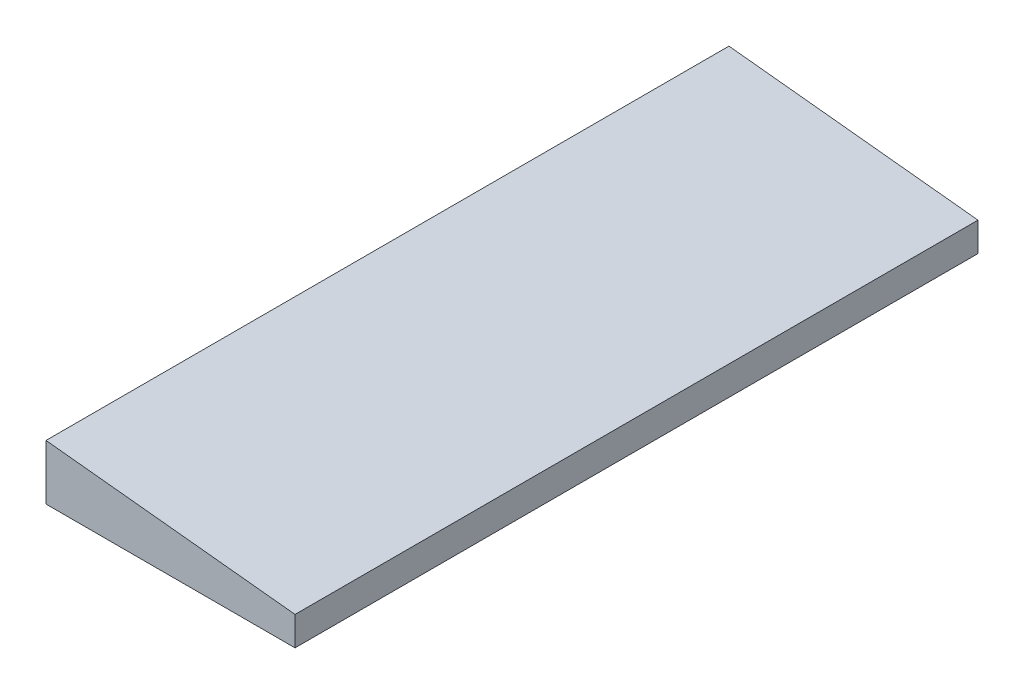
ISO-10303-21;
HEADER;
FILE_DESCRIPTION(('STEP AP214'),'2;1');
FILE_NAME('part.step','',(''),(''),'','','');
FILE_SCHEMA(('AUTOMOTIVE_DESIGN { 1 0 10303 214 1 1 1 1 }'));
ENDSEC;
DATA;
#1=APPLICATION_CONTEXT('core data for automotive mechanical design processes');
#2=APPLICATION_PROTOCOL_DEFINITION('international standard','automotive_design',2000,#1);
#3=PRODUCT_CONTEXT('',#1,'mechanical');
#4=PRODUCT('Part','Part','',(#3));
#5=PRODUCT_RELATED_PRODUCT_CATEGORY('part','',(#4));
#6=PRODUCT_DEFINITION_FORMATION('','',#4);
#7=PRODUCT_DEFINITION_CONTEXT('part definition',#1,'design');
#8=PRODUCT_DEFINITION('design','',#6,#7);
#9=PRODUCT_DEFINITION_SHAPE('','',#8);
#10=(LENGTH_UNIT() NAMED_UNIT(*) SI_UNIT(.MILLI.,.METRE.));
#11=(NAMED_UNIT(*) PLANE_ANGLE_UNIT() SI_UNIT($,.RADIAN.));
#12=(NAMED_UNIT(*) SI_UNIT($,.STERADIAN.) SOLID_ANGLE_UNIT());
#13=UNCERTAINTY_MEASURE_WITH_UNIT(LENGTH_MEASURE(1.E-05),#10,'distance_accuracy_value','');
#14=(GEOMETRIC_REPRESENTATION_CONTEXT(3) GLOBAL_UNCERTAINTY_ASSIGNED_CONTEXT((#13)) GLOBAL_UNIT_ASSIGNED_CONTEXT((#10,
#11,#12)) REPRESENTATION_CONTEXT('',''));
#15=CARTESIAN_POINT('',(0.,0.,0.));
#16=DIRECTION('',(0.,0.,1.));
#17=DIRECTION('',(1.,0.,0.));
#18=AXIS2_PLACEMENT_3D('',#15,#16,#17);
#19=CARTESIAN_POINT('',(0.,26.6479440553861,165.));
#20=DIRECTION('',(1.,0.,0.));
#21=DIRECTION('',(0.,0.,-1.));
#22=AXIS2_PLACEMENT_3D('',#19,#20,#21);
#23=PLANE('',#22);
#24=DIRECTION('',(0.,-1.,0.));
#25=VECTOR('',#24,1.);
#26=CARTESIAN_POINT('',(0.,26.6479440553861,-165.));
#27=LINE('',#26,#25);
#28=CARTESIAN_POINT('',(0.,26.6479440553861,-165.));
#29=VERTEX_POINT('',#28);
#30=CARTESIAN_POINT('',(0.,0.,-165.));
#31=VERTEX_POINT('',#30);
#32=EDGE_CURVE('E107',#29,#31,#27,.T.);
#33=ORIENTED_EDGE('',*,*,#32,.T.);
#34=DIRECTION('',(0.,0.,-1.));
#35=VECTOR('',#34,1.);
#36=CARTESIAN_POINT('',(0.,0.,165.));
#37=LINE('',#36,#35);
#38=CARTESIAN_POINT('',(0.,0.,165.));
#39=VERTEX_POINT('',#38);
#40=EDGE_CURVE('E11',#39,#31,#37,.T.);
#41=ORIENTED_EDGE('',*,*,#40,.F.);
#42=DIRECTION('',(0.,-1.,0.));
#43=VECTOR('',#42,1.);
#44=CARTESIAN_POINT('',(0.,26.6479440553861,165.));
#45=LINE('',#44,#43);
#46=CARTESIAN_POINT('',(0.,26.6479440553861,165.));
#47=VERTEX_POINT('',#46);
#48=EDGE_CURVE('E91',#47,#39,#45,.T.);
#49=ORIENTED_EDGE('',*,*,#48,.F.);
#50=DIRECTION('',(0.,0.,-1.));
#51=VECTOR('',#50,1.);
#52=CARTESIAN_POINT('',(0.,26.6479440553861,165.));
#53=LINE('',#52,#51);
#54=EDGE_CURVE('E103',#47,#29,#53,.T.);
#55=ORIENTED_EDGE('',*,*,#54,.T.);
#56=EDGE_LOOP('',(#33,#41,#49,#55));
#57=FACE_BOUND('',#56,.T.);
#58=ADVANCED_FACE('F39',(#57),#23,.F.);
#59=CARTESIAN_POINT('',(0.,0.,165.));
#60=DIRECTION('',(0.,1.,0.));
#61=DIRECTION('',(0.,0.,1.));
#62=AXIS2_PLACEMENT_3D('',#59,#60,#61);
#63=PLANE('',#62);
#64=DIRECTION('',(1.,0.,0.));
#65=VECTOR('',#64,1.);
#66=CARTESIAN_POINT('',(0.,0.,-165.));
#67=LINE('',#66,#65);
#68=CARTESIAN_POINT('',(120.337149339561,0.,-165.));
#69=VERTEX_POINT('',#68);
#70=EDGE_CURVE('E96',#31,#69,#67,.T.);
#71=ORIENTED_EDGE('',*,*,#70,.T.);
#72=DIRECTION('',(0.,0.,-1.));
#73=VECTOR('',#72,1.);
#74=CARTESIAN_POINT('',(120.337149339561,0.,165.));
#75=LINE('',#74,#73);
#76=CARTESIAN_POINT('',(120.337149339561,0.,165.));
#77=VERTEX_POINT('',#76);
#78=EDGE_CURVE('E48',#77,#69,#75,.T.);
#79=ORIENTED_EDGE('',*,*,#78,.F.);
#80=DIRECTION('',(1.,0.,0.));
#81=VECTOR('',#80,1.);
#82=CARTESIAN_POINT('',(0.,0.,165.));
#83=LINE('',#82,#81);
#84=EDGE_CURVE('E86',#39,#77,#83,.T.);
#85=ORIENTED_EDGE('',*,*,#84,.F.);
#86=ORIENTED_EDGE('',*,*,#40,.T.);
#87=EDGE_LOOP('',(#71,#79,#85,#86));
#88=FACE_BOUND('',#87,.T.);
#89=ADVANCED_FACE('F95',(#88),#63,.F.);
#90=CARTESIAN_POINT('',(120.337149339561,0.,165.));
#91=DIRECTION('',(-1.,0.,0.));
#92=DIRECTION('',(0.,0.,1.));
#93=AXIS2_PLACEMENT_3D('',#90,#91,#92);
#94=PLANE('',#93);
#95=DIRECTION('',(0.,1.,0.));
#96=VECTOR('',#95,1.);
#97=CARTESIAN_POINT('',(120.337149339561,0.,-165.));
#98=LINE('',#97,#96);
#99=CARTESIAN_POINT('',(120.337149339561,14.,-165.));
#100=VERTEX_POINT('',#99);
#101=EDGE_CURVE('E73',#69,#100,#98,.T.);
#102=ORIENTED_EDGE('',*,*,#101,.T.);
#103=DIRECTION('',(0.,0.,-1.));
#104=VECTOR('',#103,1.);
#105=CARTESIAN_POINT('',(120.337149339561,14.,165.));
#106=LINE('',#105,#104);
#107=CARTESIAN_POINT('',(120.337149339561,14.,165.));
#108=VERTEX_POINT('',#107);
#109=EDGE_CURVE('E98',#108,#100,#106,.T.);
#110=ORIENTED_EDGE('',*,*,#109,.F.);
#111=DIRECTION('',(0.,1.,0.));
#112=VECTOR('',#111,1.);
#113=CARTESIAN_POINT('',(120.337149339561,0.,165.));
#114=LINE('',#113,#112);
#115=EDGE_CURVE('E89',#77,#108,#114,.T.);
#116=ORIENTED_EDGE('',*,*,#115,.F.);
#117=ORIENTED_EDGE('',*,*,#78,.T.);
#118=EDGE_LOOP('',(#102,#110,#116,#117));
#119=FACE_BOUND('',#118,.T.);
#120=ADVANCED_FACE('F99',(#119),#94,.F.);
#121=CARTESIAN_POINT('',(120.337149339561,14.,165.));
#122=DIRECTION('',(-0.104528463267654,-0.994521895368273,0.));
#123=DIRECTION('',(0.994521895368273,-0.104528463267654,0.));
#124=AXIS2_PLACEMENT_3D('',#121,#122,#123);
#125=PLANE('',#124);
#126=DIRECTION('',(-0.994521895368273,0.104528463267654,0.));
#127=VECTOR('',#126,1.);
#128=CARTESIAN_POINT('',(120.337149339561,14.,-165.));
#129=LINE('',#128,#127);
#130=EDGE_CURVE('E79',#100,#29,#129,.T.);
#131=ORIENTED_EDGE('',*,*,#130,.T.);
#132=ORIENTED_EDGE('',*,*,#54,.F.);
#133=DIRECTION('',(-0.994521895368273,0.104528463267654,0.));
#134=VECTOR('',#133,1.);
#135=CARTESIAN_POINT('',(120.337149339561,14.,165.));
#136=LINE('',#135,#134);
#137=EDGE_CURVE('E56',#108,#47,#136,.T.);
#138=ORIENTED_EDGE('',*,*,#137,.F.);
#139=ORIENTED_EDGE('',*,*,#109,.T.);
#140=EDGE_LOOP('',(#131,#132,#138,#139));
#141=FACE_BOUND('',#140,.T.);
#142=ADVANCED_FACE('F120',(#141),#125,.F.);
#143=CARTESIAN_POINT('',(0.,0.,165.));
#144=DIRECTION('',(0.,0.,1.));
#145=DIRECTION('',(1.,0.,0.));
#146=AXIS2_PLACEMENT_3D('',#143,#144,#145);
#147=PLANE('',#146);
#148=ORIENTED_EDGE('',*,*,#48,.T.);
#149=ORIENTED_EDGE('',*,*,#84,.T.);
#150=ORIENTED_EDGE('',*,*,#115,.T.);
#151=ORIENTED_EDGE('',*,*,#137,.T.);
#152=EDGE_LOOP('',(#148,#149,#150,#151));
#153=FACE_BOUND('',#152,.T.);
#154=ADVANCED_FACE('F87',(#153),#147,.T.);
#155=CARTESIAN_POINT('',(0.,0.,-165.));
#156=DIRECTION('',(0.,0.,1.));
#157=DIRECTION('',(1.,0.,0.));
#158=AXIS2_PLACEMENT_3D('',#155,#156,#157);
#159=PLANE('',#158);
#160=ORIENTED_EDGE('',*,*,#32,.F.);
#161=ORIENTED_EDGE('',*,*,#130,.F.);
#162=ORIENTED_EDGE('',*,*,#101,.F.);
#163=ORIENTED_EDGE('',*,*,#70,.F.);
#164=EDGE_LOOP('',(#160,#161,#162,#163));
#165=FACE_BOUND('',#164,.T.);
#166=ADVANCED_FACE('F123',(#165),#159,.F.);
#167=CLOSED_SHELL('',(#58,#89,#120,#142,#154,#166));
#168=MANIFOLD_SOLID_BREP('B2',#167);
#169=ADVANCED_BREP_SHAPE_REPRESENTATION('',(#18,#168),#14);
#170=SHAPE_DEFINITION_REPRESENTATION(#9,#169);
ENDSEC;
END-ISO-10303-21;
